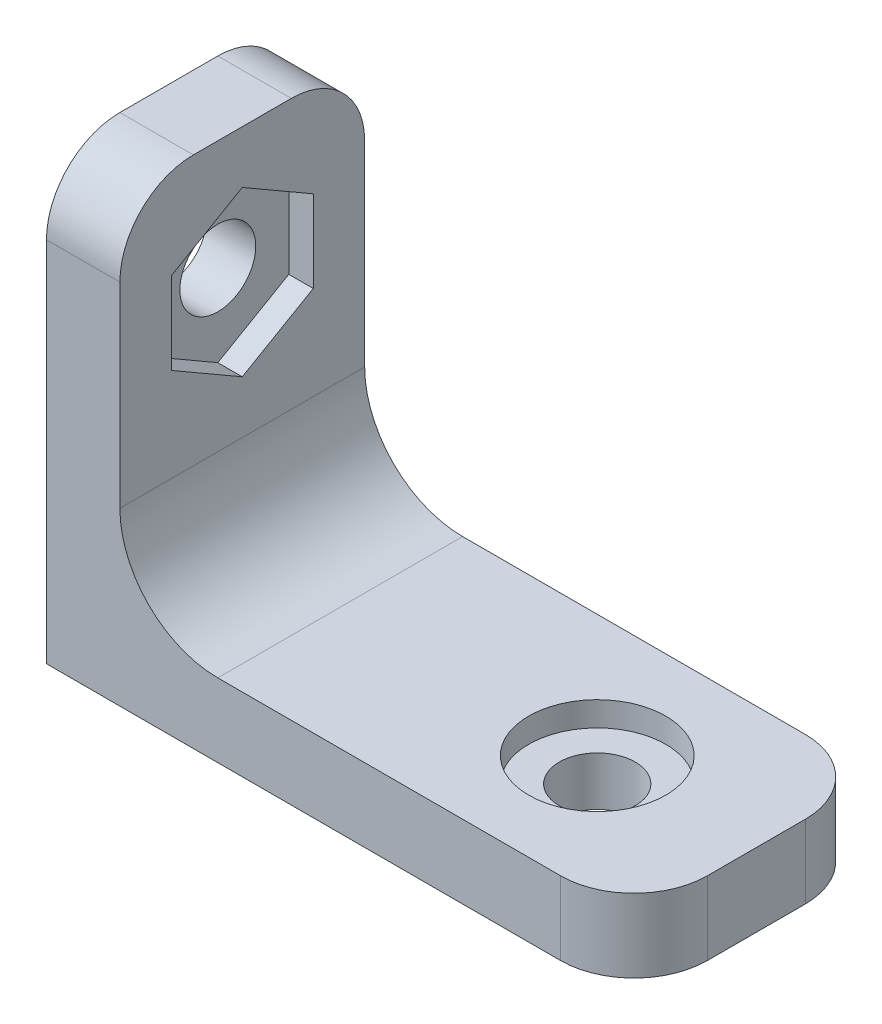
ISO-10303-21;
HEADER;
FILE_DESCRIPTION(('STEP AP214'),'2;1');
FILE_NAME('part.step','',(''),(''),'','','');
FILE_SCHEMA(('AUTOMOTIVE_DESIGN { 1 0 10303 214 1 1 1 1 }'));
ENDSEC;
DATA;
#1=APPLICATION_CONTEXT('core data for automotive mechanical design processes');
#2=APPLICATION_PROTOCOL_DEFINITION('international standard','automotive_design',2000,#1);
#3=PRODUCT_CONTEXT('',#1,'mechanical');
#4=PRODUCT('Part','Part','',(#3));
#5=PRODUCT_RELATED_PRODUCT_CATEGORY('part','',(#4));
#6=PRODUCT_DEFINITION_FORMATION('','',#4);
#7=PRODUCT_DEFINITION_CONTEXT('part definition',#1,'design');
#8=PRODUCT_DEFINITION('design','',#6,#7);
#9=PRODUCT_DEFINITION_SHAPE('','',#8);
#10=(LENGTH_UNIT() NAMED_UNIT(*) SI_UNIT(.MILLI.,.METRE.));
#11=(NAMED_UNIT(*) PLANE_ANGLE_UNIT() SI_UNIT($,.RADIAN.));
#12=(NAMED_UNIT(*) SI_UNIT($,.STERADIAN.) SOLID_ANGLE_UNIT());
#13=UNCERTAINTY_MEASURE_WITH_UNIT(LENGTH_MEASURE(1.E-05),#10,'distance_accuracy_value','');
#14=(GEOMETRIC_REPRESENTATION_CONTEXT(3) GLOBAL_UNCERTAINTY_ASSIGNED_CONTEXT((#13)) GLOBAL_UNIT_ASSIGNED_CONTEXT((#10,
#11,#12)) REPRESENTATION_CONTEXT('',''));
#15=CARTESIAN_POINT('',(0.,0.,0.));
#16=DIRECTION('',(0.,0.,1.));
#17=DIRECTION('',(1.,0.,0.));
#18=AXIS2_PLACEMENT_3D('',#15,#16,#17);
#19=CARTESIAN_POINT('',(7.3840620433566,12.5,-5.));
#20=DIRECTION('',(-1.,0.,0.));
#21=DIRECTION('',(0.,0.,1.));
#22=AXIS2_PLACEMENT_3D('',#19,#20,#21);
#23=CYLINDRICAL_SURFACE('',#22,1.55);
#24=CARTESIAN_POINT('',(0.,12.5,-5.));
#25=DIRECTION('',(-1.,0.,0.));
#26=DIRECTION('',(0.,0.,1.));
#27=AXIS2_PLACEMENT_3D('',#24,#25,#26);
#28=CIRCLE('',#27,1.55);
#29=CARTESIAN_POINT('',(0.,12.5,-3.45));
#30=VERTEX_POINT('',#29);
#31=EDGE_CURVE('E276',#30,#30,#28,.T.);
#32=ORIENTED_EDGE('',*,*,#31,.T.);
#33=EDGE_LOOP('',(#32));
#34=FACE_BOUND('',#33,.T.);
#35=CARTESIAN_POINT('',(2.,12.5,-5.));
#36=DIRECTION('',(1.,0.,0.));
#37=DIRECTION('',(0.,0.,-1.));
#38=AXIS2_PLACEMENT_3D('',#35,#36,#37);
#39=CIRCLE('',#38,1.55);
#40=CARTESIAN_POINT('',(2.,12.5,-6.55));
#41=VERTEX_POINT('',#40);
#42=EDGE_CURVE('E255',#41,#41,#39,.F.);
#43=ORIENTED_EDGE('',*,*,#42,.F.);
#44=EDGE_LOOP('',(#43));
#45=FACE_BOUND('',#44,.T.);
#46=ADVANCED_FACE('F36',(#34,#45),#23,.F.);
#47=CARTESIAN_POINT('',(17.5,3.,-5.));
#48=DIRECTION('',(0.,-1.,0.));
#49=DIRECTION('',(0.,0.,-1.));
#50=AXIS2_PLACEMENT_3D('',#47,#48,#49);
#51=CYLINDRICAL_SURFACE('',#50,1.55);
#52=CARTESIAN_POINT('',(17.5,0.,-5.));
#53=DIRECTION('',(0.,1.,0.));
#54=DIRECTION('',(0.,0.,1.));
#55=AXIS2_PLACEMENT_3D('',#52,#53,#54);
#56=CIRCLE('',#55,1.55);
#57=CARTESIAN_POINT('',(17.5,0.,-3.45));
#58=VERTEX_POINT('',#57);
#59=EDGE_CURVE('E295',#58,#58,#56,.T.);
#60=ORIENTED_EDGE('',*,*,#59,.F.);
#61=EDGE_LOOP('',(#60));
#62=FACE_BOUND('',#61,.T.);
#63=CARTESIAN_POINT('',(17.5,2.,-5.));
#64=DIRECTION('',(0.,1.,0.));
#65=DIRECTION('',(0.,0.,1.));
#66=AXIS2_PLACEMENT_3D('',#63,#64,#65);
#67=CIRCLE('',#66,1.55);
#68=CARTESIAN_POINT('',(17.5,2.,-3.45));
#69=VERTEX_POINT('',#68);
#70=EDGE_CURVE('E271',#69,#69,#67,.T.);
#71=ORIENTED_EDGE('',*,*,#70,.T.);
#72=EDGE_LOOP('',(#71));
#73=FACE_BOUND('',#72,.T.);
#74=ADVANCED_FACE('F430',(#62,#73),#51,.F.);
#75=CARTESIAN_POINT('',(0.,3.,0.));
#76=DIRECTION('',(0.,-1.,0.));
#77=DIRECTION('',(0.,0.,-1.));
#78=AXIS2_PLACEMENT_3D('',#75,#76,#77);
#79=PLANE('',#78);
#80=CARTESIAN_POINT('',(17.5,3.,-5.));
#81=DIRECTION('',(0.,1.,0.));
#82=DIRECTION('',(0.,0.,1.));
#83=AXIS2_PLACEMENT_3D('',#80,#81,#82);
#84=CIRCLE('',#83,2.8);
#85=CARTESIAN_POINT('',(17.5,3.,-2.2));
#86=VERTEX_POINT('',#85);
#87=EDGE_CURVE('E272',#86,#86,#84,.T.);
#88=ORIENTED_EDGE('',*,*,#87,.F.);
#89=EDGE_LOOP('',(#88));
#90=FACE_BOUND('',#89,.T.);
#91=DIRECTION('',(-1.,0.,0.));
#92=VECTOR('',#91,1.);
#93=CARTESIAN_POINT('',(0.,3.,-10.));
#94=LINE('',#93,#92);
#95=CARTESIAN_POINT('',(21.,3.,-10.));
#96=VERTEX_POINT('',#95);
#97=CARTESIAN_POINT('',(7.,3.,-10.));
#98=VERTEX_POINT('',#97);
#99=EDGE_CURVE('E308',#96,#98,#94,.T.);
#100=ORIENTED_EDGE('',*,*,#99,.T.);
#101=DIRECTION('',(0.,0.,-1.));
#102=VECTOR('',#101,1.);
#103=CARTESIAN_POINT('',(7.,3.,0.));
#104=LINE('',#103,#102);
#105=CARTESIAN_POINT('',(7.,3.,0.));
#106=VERTEX_POINT('',#105);
#107=EDGE_CURVE('E62',#98,#106,#104,.F.);
#108=ORIENTED_EDGE('',*,*,#107,.T.);
#109=DIRECTION('',(1.,0.,0.));
#110=VECTOR('',#109,1.);
#111=CARTESIAN_POINT('',(0.,3.,0.));
#112=LINE('',#111,#110);
#113=CARTESIAN_POINT('',(21.,3.,0.));
#114=VERTEX_POINT('',#113);
#115=EDGE_CURVE('E300',#106,#114,#112,.T.);
#116=ORIENTED_EDGE('',*,*,#115,.T.);
#117=CARTESIAN_POINT('',(21.,3.,-3.));
#118=DIRECTION('',(0.,-1.,0.));
#119=DIRECTION('',(0.,0.,-1.));
#120=AXIS2_PLACEMENT_3D('',#117,#118,#119);
#121=CIRCLE('',#120,3.);
#122=CARTESIAN_POINT('',(24.,3.,-3.));
#123=VERTEX_POINT('',#122);
#124=EDGE_CURVE('E387',#114,#123,#121,.F.);
#125=ORIENTED_EDGE('',*,*,#124,.T.);
#126=DIRECTION('',(0.,0.,-1.));
#127=VECTOR('',#126,1.);
#128=CARTESIAN_POINT('',(24.,3.,0.));
#129=LINE('',#128,#127);
#130=CARTESIAN_POINT('',(24.,3.,-7.));
#131=VERTEX_POINT('',#130);
#132=EDGE_CURVE('E303',#123,#131,#129,.T.);
#133=ORIENTED_EDGE('',*,*,#132,.T.);
#134=CARTESIAN_POINT('',(21.,3.,-7.));
#135=DIRECTION('',(0.,-1.,0.));
#136=DIRECTION('',(0.,0.,-1.));
#137=AXIS2_PLACEMENT_3D('',#134,#135,#136);
#138=CIRCLE('',#137,3.);
#139=EDGE_CURVE('E384',#131,#96,#138,.F.);
#140=ORIENTED_EDGE('',*,*,#139,.T.);
#141=EDGE_LOOP('',(#100,#108,#116,#125,#133,#140));
#142=FACE_BOUND('',#141,.T.);
#143=ADVANCED_FACE('F436',(#90,#142),#79,.F.);
#144=CARTESIAN_POINT('',(0.,0.,0.));
#145=DIRECTION('',(0.,-1.,0.));
#146=DIRECTION('',(0.,0.,-1.));
#147=AXIS2_PLACEMENT_3D('',#144,#145,#146);
#148=PLANE('',#147);
#149=DIRECTION('',(0.,0.,-1.));
#150=VECTOR('',#149,1.);
#151=CARTESIAN_POINT('',(24.,0.,0.));
#152=LINE('',#151,#150);
#153=CARTESIAN_POINT('',(24.,0.,-3.));
#154=VERTEX_POINT('',#153);
#155=CARTESIAN_POINT('',(24.,0.,-7.));
#156=VERTEX_POINT('',#155);
#157=EDGE_CURVE('E319',#154,#156,#152,.T.);
#158=ORIENTED_EDGE('',*,*,#157,.F.);
#159=CARTESIAN_POINT('',(21.,0.,-3.));
#160=DIRECTION('',(0.,-1.,0.));
#161=DIRECTION('',(0.,0.,-1.));
#162=AXIS2_PLACEMENT_3D('',#159,#160,#161);
#163=CIRCLE('',#162,3.);
#164=CARTESIAN_POINT('',(21.,0.,0.));
#165=VERTEX_POINT('',#164);
#166=EDGE_CURVE('E381',#154,#165,#163,.T.);
#167=ORIENTED_EDGE('',*,*,#166,.T.);
#168=DIRECTION('',(1.,0.,0.));
#169=VECTOR('',#168,1.);
#170=CARTESIAN_POINT('',(0.,0.,0.));
#171=LINE('',#170,#169);
#172=CARTESIAN_POINT('',(0.,0.,0.));
#173=VERTEX_POINT('',#172);
#174=EDGE_CURVE('E315',#173,#165,#171,.T.);
#175=ORIENTED_EDGE('',*,*,#174,.F.);
#176=DIRECTION('',(0.,0.,1.));
#177=VECTOR('',#176,1.);
#178=CARTESIAN_POINT('',(0.,0.,0.));
#179=LINE('',#178,#177);
#180=CARTESIAN_POINT('',(0.,0.,-10.));
#181=VERTEX_POINT('',#180);
#182=EDGE_CURVE('E299',#181,#173,#179,.T.);
#183=ORIENTED_EDGE('',*,*,#182,.F.);
#184=DIRECTION('',(-1.,0.,0.));
#185=VECTOR('',#184,1.);
#186=CARTESIAN_POINT('',(0.,0.,-10.));
#187=LINE('',#186,#185);
#188=CARTESIAN_POINT('',(21.,0.,-10.));
#189=VERTEX_POINT('',#188);
#190=EDGE_CURVE('E304',#189,#181,#187,.T.);
#191=ORIENTED_EDGE('',*,*,#190,.F.);
#192=CARTESIAN_POINT('',(21.,0.,-7.));
#193=DIRECTION('',(0.,-1.,0.));
#194=DIRECTION('',(0.,0.,-1.));
#195=AXIS2_PLACEMENT_3D('',#192,#193,#194);
#196=CIRCLE('',#195,3.);
#197=EDGE_CURVE('E378',#189,#156,#196,.T.);
#198=ORIENTED_EDGE('',*,*,#197,.T.);
#199=EDGE_LOOP('',(#158,#167,#175,#183,#191,#198));
#200=FACE_BOUND('',#199,.T.);
#201=ORIENTED_EDGE('',*,*,#59,.T.);
#202=EDGE_LOOP('',(#201));
#203=FACE_BOUND('',#202,.T.);
#204=ADVANCED_FACE('F451',(#200,#203),#148,.T.);
#205=CARTESIAN_POINT('',(0.,3.,0.));
#206=DIRECTION('',(1.,0.,0.));
#207=DIRECTION('',(0.,0.,-1.));
#208=AXIS2_PLACEMENT_3D('',#205,#206,#207);
#209=PLANE('',#208);
#210=ORIENTED_EDGE('',*,*,#31,.F.);
#211=EDGE_LOOP('',(#210));
#212=FACE_BOUND('',#211,.T.);
#213=DIRECTION('',(0.,0.,1.));
#214=VECTOR('',#213,1.);
#215=CARTESIAN_POINT('',(0.,18.,-10.));
#216=LINE('',#215,#214);
#217=CARTESIAN_POINT('',(0.,18.,-7.));
#218=VERTEX_POINT('',#217);
#219=CARTESIAN_POINT('',(0.,18.,-3.));
#220=VERTEX_POINT('',#219);
#221=EDGE_CURVE('E280',#218,#220,#216,.T.);
#222=ORIENTED_EDGE('',*,*,#221,.F.);
#223=CARTESIAN_POINT('',(0.,15.,-7.));
#224=DIRECTION('',(1.,0.,0.));
#225=DIRECTION('',(0.,0.,-1.));
#226=AXIS2_PLACEMENT_3D('',#223,#224,#225);
#227=CIRCLE('',#226,3.);
#228=CARTESIAN_POINT('',(0.,15.,-10.));
#229=VERTEX_POINT('',#228);
#230=EDGE_CURVE('E348',#218,#229,#227,.F.);
#231=ORIENTED_EDGE('',*,*,#230,.T.);
#232=DIRECTION('',(0.,-1.,0.));
#233=VECTOR('',#232,1.);
#234=CARTESIAN_POINT('',(0.,3.,-10.));
#235=LINE('',#234,#233);
#236=EDGE_CURVE('E311',#229,#181,#235,.T.);
#237=ORIENTED_EDGE('',*,*,#236,.T.);
#238=ORIENTED_EDGE('',*,*,#182,.T.);
#239=DIRECTION('',(0.,-1.,0.));
#240=VECTOR('',#239,1.);
#241=CARTESIAN_POINT('',(0.,3.,0.));
#242=LINE('',#241,#240);
#243=CARTESIAN_POINT('',(0.,15.,0.));
#244=VERTEX_POINT('',#243);
#245=EDGE_CURVE('E328',#244,#173,#242,.T.);
#246=ORIENTED_EDGE('',*,*,#245,.F.);
#247=CARTESIAN_POINT('',(0.,15.,-3.));
#248=DIRECTION('',(1.,0.,0.));
#249=DIRECTION('',(0.,0.,-1.));
#250=AXIS2_PLACEMENT_3D('',#247,#248,#249);
#251=CIRCLE('',#250,3.);
#252=EDGE_CURVE('E345',#244,#220,#251,.F.);
#253=ORIENTED_EDGE('',*,*,#252,.T.);
#254=EDGE_LOOP('',(#222,#231,#237,#238,#246,#253));
#255=FACE_BOUND('',#254,.T.);
#256=ADVANCED_FACE('F455',(#212,#255),#209,.F.);
#257=CARTESIAN_POINT('',(0.,3.,0.));
#258=DIRECTION('',(0.,0.,-1.));
#259=DIRECTION('',(-1.,0.,0.));
#260=AXIS2_PLACEMENT_3D('',#257,#258,#259);
#261=PLANE('',#260);
#262=DIRECTION('',(0.,-1.,0.));
#263=VECTOR('',#262,1.);
#264=CARTESIAN_POINT('',(3.,18.,0.));
#265=LINE('',#264,#263);
#266=CARTESIAN_POINT('',(3.,15.,0.));
#267=VERTEX_POINT('',#266);
#268=CARTESIAN_POINT('',(3.,7.,0.));
#269=VERTEX_POINT('',#268);
#270=EDGE_CURVE('E291',#267,#269,#265,.T.);
#271=ORIENTED_EDGE('',*,*,#270,.F.);
#272=DIRECTION('',(1.,0.,0.));
#273=VECTOR('',#272,1.);
#274=CARTESIAN_POINT('',(0.,15.,0.));
#275=LINE('',#274,#273);
#276=EDGE_CURVE('E368',#267,#244,#275,.F.);
#277=ORIENTED_EDGE('',*,*,#276,.T.);
#278=ORIENTED_EDGE('',*,*,#245,.T.);
#279=ORIENTED_EDGE('',*,*,#174,.T.);
#280=DIRECTION('',(0.,-1.,0.));
#281=VECTOR('',#280,1.);
#282=CARTESIAN_POINT('',(21.,3.,0.));
#283=LINE('',#282,#281);
#284=EDGE_CURVE('E364',#165,#114,#283,.F.);
#285=ORIENTED_EDGE('',*,*,#284,.T.);
#286=ORIENTED_EDGE('',*,*,#115,.F.);
#287=CARTESIAN_POINT('',(7.,7.,0.));
#288=DIRECTION('',(0.,0.,-1.));
#289=DIRECTION('',(-1.,0.,0.));
#290=AXIS2_PLACEMENT_3D('',#287,#288,#289);
#291=CIRCLE('',#290,4.);
#292=EDGE_CURVE('E11',#106,#269,#291,.T.);
#293=ORIENTED_EDGE('',*,*,#292,.T.);
#294=EDGE_LOOP('',(#271,#277,#278,#279,#285,#286,#293));
#295=FACE_BOUND('',#294,.T.);
#296=ADVANCED_FACE('F420',(#295),#261,.F.);
#297=CARTESIAN_POINT('',(24.,3.,0.));
#298=DIRECTION('',(-1.,0.,0.));
#299=DIRECTION('',(0.,0.,1.));
#300=AXIS2_PLACEMENT_3D('',#297,#298,#299);
#301=PLANE('',#300);
#302=ORIENTED_EDGE('',*,*,#132,.F.);
#303=DIRECTION('',(0.,-1.,0.));
#304=VECTOR('',#303,1.);
#305=CARTESIAN_POINT('',(24.,3.,-3.));
#306=LINE('',#305,#304);
#307=EDGE_CURVE('E374',#123,#154,#306,.T.);
#308=ORIENTED_EDGE('',*,*,#307,.T.);
#309=ORIENTED_EDGE('',*,*,#157,.T.);
#310=DIRECTION('',(0.,-1.,0.));
#311=VECTOR('',#310,1.);
#312=CARTESIAN_POINT('',(24.,3.,-7.));
#313=LINE('',#312,#311);
#314=EDGE_CURVE('E371',#156,#131,#313,.F.);
#315=ORIENTED_EDGE('',*,*,#314,.T.);
#316=EDGE_LOOP('',(#302,#308,#309,#315));
#317=FACE_BOUND('',#316,.T.);
#318=ADVANCED_FACE('F459',(#317),#301,.F.);
#319=CARTESIAN_POINT('',(0.,3.,-10.));
#320=DIRECTION('',(0.,0.,1.));
#321=DIRECTION('',(1.,0.,0.));
#322=AXIS2_PLACEMENT_3D('',#319,#320,#321);
#323=PLANE('',#322);
#324=ORIENTED_EDGE('',*,*,#236,.F.);
#325=DIRECTION('',(-1.,0.,0.));
#326=VECTOR('',#325,1.);
#327=CARTESIAN_POINT('',(3.,15.,-10.));
#328=LINE('',#327,#326);
#329=CARTESIAN_POINT('',(3.,15.,-10.));
#330=VERTEX_POINT('',#329);
#331=EDGE_CURVE('E355',#229,#330,#328,.F.);
#332=ORIENTED_EDGE('',*,*,#331,.T.);
#333=DIRECTION('',(0.,-1.,0.));
#334=VECTOR('',#333,1.);
#335=CARTESIAN_POINT('',(3.,18.,-10.));
#336=LINE('',#335,#334);
#337=CARTESIAN_POINT('',(3.,7.,-10.));
#338=VERTEX_POINT('',#337);
#339=EDGE_CURVE('E288',#330,#338,#336,.T.);
#340=ORIENTED_EDGE('',*,*,#339,.T.);
#341=CARTESIAN_POINT('',(7.,7.,-10.));
#342=DIRECTION('',(0.,0.,1.));
#343=DIRECTION('',(1.,0.,0.));
#344=AXIS2_PLACEMENT_3D('',#341,#342,#343);
#345=CIRCLE('',#344,4.);
#346=EDGE_CURVE('E45',#338,#98,#345,.T.);
#347=ORIENTED_EDGE('',*,*,#346,.T.);
#348=ORIENTED_EDGE('',*,*,#99,.F.);
#349=DIRECTION('',(0.,-1.,0.));
#350=VECTOR('',#349,1.);
#351=CARTESIAN_POINT('',(21.,3.,-10.));
#352=LINE('',#351,#350);
#353=EDGE_CURVE('E351',#96,#189,#352,.T.);
#354=ORIENTED_EDGE('',*,*,#353,.T.);
#355=ORIENTED_EDGE('',*,*,#190,.T.);
#356=EDGE_LOOP('',(#324,#332,#340,#347,#348,#354,#355));
#357=FACE_BOUND('',#356,.T.);
#358=ADVANCED_FACE('F405',(#357),#323,.F.);
#359=CARTESIAN_POINT('',(3.,18.,-10.));
#360=DIRECTION('',(-1.,0.,0.));
#361=DIRECTION('',(0.,0.,1.));
#362=AXIS2_PLACEMENT_3D('',#359,#360,#361);
#363=PLANE('',#362);
#364=DIRECTION('',(0.,0.5,0.866025403784439));
#365=VECTOR('',#364,1.);
#366=CARTESIAN_POINT('',(3.,14.1743157806499,-7.9));
#367=LINE('',#366,#365);
#368=CARTESIAN_POINT('',(3.,14.1743157806499,-7.9));
#369=VERTEX_POINT('',#368);
#370=CARTESIAN_POINT('',(3.,15.8486315612998,-5.));
#371=VERTEX_POINT('',#370);
#372=EDGE_CURVE('E238',#369,#371,#367,.T.);
#373=ORIENTED_EDGE('',*,*,#372,.F.);
#374=DIRECTION('',(0.,1.,0.));
#375=VECTOR('',#374,1.);
#376=CARTESIAN_POINT('',(3.,10.8256842193501,-7.9));
#377=LINE('',#376,#375);
#378=CARTESIAN_POINT('',(3.,10.8256842193501,-7.9));
#379=VERTEX_POINT('',#378);
#380=EDGE_CURVE('E196',#379,#369,#377,.T.);
#381=ORIENTED_EDGE('',*,*,#380,.F.);
#382=DIRECTION('',(0.,0.5,-0.866025403784439));
#383=VECTOR('',#382,1.);
#384=CARTESIAN_POINT('',(3.,9.15136843870017,-5.));
#385=LINE('',#384,#383);
#386=CARTESIAN_POINT('',(3.,9.15136843870017,-5.));
#387=VERTEX_POINT('',#386);
#388=EDGE_CURVE('E218',#387,#379,#385,.T.);
#389=ORIENTED_EDGE('',*,*,#388,.F.);
#390=DIRECTION('',(0.,-0.5,-0.866025403784439));
#391=VECTOR('',#390,1.);
#392=CARTESIAN_POINT('',(3.,10.8256842193501,-2.1));
#393=LINE('',#392,#391);
#394=CARTESIAN_POINT('',(3.,10.8256842193501,-2.1));
#395=VERTEX_POINT('',#394);
#396=EDGE_CURVE('E222',#395,#387,#393,.T.);
#397=ORIENTED_EDGE('',*,*,#396,.F.);
#398=DIRECTION('',(0.,-1.,0.));
#399=VECTOR('',#398,1.);
#400=CARTESIAN_POINT('',(3.,14.1743157806499,-2.1));
#401=LINE('',#400,#399);
#402=CARTESIAN_POINT('',(3.,14.1743157806499,-2.1));
#403=VERTEX_POINT('',#402);
#404=EDGE_CURVE('E245',#403,#395,#401,.T.);
#405=ORIENTED_EDGE('',*,*,#404,.F.);
#406=DIRECTION('',(0.,-0.5,0.866025403784439));
#407=VECTOR('',#406,1.);
#408=CARTESIAN_POINT('',(3.,15.8486315612998,-5.));
#409=LINE('',#408,#407);
#410=EDGE_CURVE('E241',#371,#403,#409,.T.);
#411=ORIENTED_EDGE('',*,*,#410,.F.);
#412=EDGE_LOOP('',(#373,#381,#389,#397,#405,#411));
#413=FACE_BOUND('',#412,.T.);
#414=ORIENTED_EDGE('',*,*,#270,.T.);
#415=DIRECTION('',(0.,0.,-1.));
#416=VECTOR('',#415,1.);
#417=CARTESIAN_POINT('',(3.,7.,-10.));
#418=LINE('',#417,#416);
#419=EDGE_CURVE('E390',#269,#338,#418,.T.);
#420=ORIENTED_EDGE('',*,*,#419,.T.);
#421=ORIENTED_EDGE('',*,*,#339,.F.);
#422=CARTESIAN_POINT('',(3.,15.,-7.));
#423=DIRECTION('',(-1.,0.,0.));
#424=DIRECTION('',(0.,0.,1.));
#425=AXIS2_PLACEMENT_3D('',#422,#423,#424);
#426=CIRCLE('',#425,3.);
#427=CARTESIAN_POINT('',(3.,18.,-7.));
#428=VERTEX_POINT('',#427);
#429=EDGE_CURVE('E361',#330,#428,#426,.F.);
#430=ORIENTED_EDGE('',*,*,#429,.T.);
#431=DIRECTION('',(0.,0.,-1.));
#432=VECTOR('',#431,1.);
#433=CARTESIAN_POINT('',(3.,18.,-10.));
#434=LINE('',#433,#432);
#435=CARTESIAN_POINT('',(3.,18.,-3.));
#436=VERTEX_POINT('',#435);
#437=EDGE_CURVE('E284',#436,#428,#434,.T.);
#438=ORIENTED_EDGE('',*,*,#437,.F.);
#439=CARTESIAN_POINT('',(3.,15.,-3.));
#440=DIRECTION('',(-1.,0.,0.));
#441=DIRECTION('',(0.,0.,1.));
#442=AXIS2_PLACEMENT_3D('',#439,#440,#441);
#443=CIRCLE('',#442,3.);
#444=EDGE_CURVE('E358',#436,#267,#443,.F.);
#445=ORIENTED_EDGE('',*,*,#444,.T.);
#446=EDGE_LOOP('',(#414,#420,#421,#430,#438,#445));
#447=FACE_BOUND('',#446,.T.);
#448=ADVANCED_FACE('F399',(#413,#447),#363,.F.);
#449=CARTESIAN_POINT('',(0.,18.,0.));
#450=DIRECTION('',(0.,1.,0.));
#451=DIRECTION('',(0.,0.,1.));
#452=AXIS2_PLACEMENT_3D('',#449,#450,#451);
#453=PLANE('',#452);
#454=ORIENTED_EDGE('',*,*,#437,.T.);
#455=DIRECTION('',(-1.,0.,0.));
#456=VECTOR('',#455,1.);
#457=CARTESIAN_POINT('',(0.,18.,-7.));
#458=LINE('',#457,#456);
#459=EDGE_CURVE('E341',#428,#218,#458,.T.);
#460=ORIENTED_EDGE('',*,*,#459,.T.);
#461=ORIENTED_EDGE('',*,*,#221,.T.);
#462=DIRECTION('',(1.,0.,0.));
#463=VECTOR('',#462,1.);
#464=CARTESIAN_POINT('',(3.,18.,-3.));
#465=LINE('',#464,#463);
#466=EDGE_CURVE('E331',#220,#436,#465,.T.);
#467=ORIENTED_EDGE('',*,*,#466,.T.);
#468=EDGE_LOOP('',(#454,#460,#461,#467));
#469=FACE_BOUND('',#468,.T.);
#470=ADVANCED_FACE('F412',(#469),#453,.T.);
#471=CARTESIAN_POINT('',(17.5,2.,-5.));
#472=DIRECTION('',(0.,1.,0.));
#473=DIRECTION('',(0.,0.,1.));
#474=AXIS2_PLACEMENT_3D('',#471,#472,#473);
#475=CYLINDRICAL_SURFACE('',#474,2.8);
#476=CARTESIAN_POINT('',(17.5,2.,-5.));
#477=DIRECTION('',(0.,1.,0.));
#478=DIRECTION('',(0.,0.,1.));
#479=AXIS2_PLACEMENT_3D('',#476,#477,#478);
#480=CIRCLE('',#479,2.8);
#481=CARTESIAN_POINT('',(17.5,2.,-2.2));
#482=VERTEX_POINT('',#481);
#483=EDGE_CURVE('E267',#482,#482,#480,.T.);
#484=ORIENTED_EDGE('',*,*,#483,.F.);
#485=EDGE_LOOP('',(#484));
#486=FACE_BOUND('',#485,.T.);
#487=ORIENTED_EDGE('',*,*,#87,.T.);
#488=EDGE_LOOP('',(#487));
#489=FACE_BOUND('',#488,.T.);
#490=ADVANCED_FACE('F442',(#486,#489),#475,.F.);
#491=CARTESIAN_POINT('',(17.5,2.,-5.));
#492=DIRECTION('',(0.,1.,0.));
#493=DIRECTION('',(0.,0.,1.));
#494=AXIS2_PLACEMENT_3D('',#491,#492,#493);
#495=PLANE('',#494);
#496=ORIENTED_EDGE('',*,*,#70,.F.);
#497=EDGE_LOOP('',(#496));
#498=FACE_BOUND('',#497,.T.);
#499=ORIENTED_EDGE('',*,*,#483,.T.);
#500=EDGE_LOOP('',(#499));
#501=FACE_BOUND('',#500,.T.);
#502=ADVANCED_FACE('F493',(#498,#501),#495,.T.);
#503=CARTESIAN_POINT('',(2.,0.,0.));
#504=DIRECTION('',(1.,0.,0.));
#505=DIRECTION('',(0.,0.,-1.));
#506=AXIS2_PLACEMENT_3D('',#503,#504,#505);
#507=PLANE('',#506);
#508=DIRECTION('',(0.,1.,0.));
#509=VECTOR('',#508,1.);
#510=CARTESIAN_POINT('',(2.,10.8256842193501,-7.9));
#511=LINE('',#510,#509);
#512=CARTESIAN_POINT('',(2.,10.8256842193501,-7.9));
#513=VERTEX_POINT('',#512);
#514=CARTESIAN_POINT('',(2.,14.1743157806499,-7.9));
#515=VERTEX_POINT('',#514);
#516=EDGE_CURVE('E193',#513,#515,#511,.T.);
#517=ORIENTED_EDGE('',*,*,#516,.T.);
#518=DIRECTION('',(0.,0.5,0.866025403784439));
#519=VECTOR('',#518,1.);
#520=CARTESIAN_POINT('',(2.,14.1743157806499,-7.9));
#521=LINE('',#520,#519);
#522=CARTESIAN_POINT('',(2.,15.8486315612998,-5.));
#523=VERTEX_POINT('',#522);
#524=EDGE_CURVE('E205',#515,#523,#521,.T.);
#525=ORIENTED_EDGE('',*,*,#524,.T.);
#526=DIRECTION('',(0.,-0.5,0.866025403784439));
#527=VECTOR('',#526,1.);
#528=CARTESIAN_POINT('',(2.,15.8486315612998,-5.));
#529=LINE('',#528,#527);
#530=CARTESIAN_POINT('',(2.,14.1743157806499,-2.1));
#531=VERTEX_POINT('',#530);
#532=EDGE_CURVE('E211',#523,#531,#529,.T.);
#533=ORIENTED_EDGE('',*,*,#532,.T.);
#534=DIRECTION('',(0.,-1.,0.));
#535=VECTOR('',#534,1.);
#536=CARTESIAN_POINT('',(2.,14.1743157806499,-2.1));
#537=LINE('',#536,#535);
#538=CARTESIAN_POINT('',(2.,10.8256842193501,-2.1));
#539=VERTEX_POINT('',#538);
#540=EDGE_CURVE('E227',#531,#539,#537,.T.);
#541=ORIENTED_EDGE('',*,*,#540,.T.);
#542=DIRECTION('',(0.,-0.5,-0.866025403784439));
#543=VECTOR('',#542,1.);
#544=CARTESIAN_POINT('',(2.,10.8256842193501,-2.1));
#545=LINE('',#544,#543);
#546=CARTESIAN_POINT('',(2.,9.15136843870017,-5.));
#547=VERTEX_POINT('',#546);
#548=EDGE_CURVE('E231',#539,#547,#545,.T.);
#549=ORIENTED_EDGE('',*,*,#548,.T.);
#550=DIRECTION('',(0.,0.5,-0.866025403784439));
#551=VECTOR('',#550,1.);
#552=CARTESIAN_POINT('',(2.,9.15136843870017,-5.));
#553=LINE('',#552,#551);
#554=EDGE_CURVE('E202',#547,#513,#553,.T.);
#555=ORIENTED_EDGE('',*,*,#554,.T.);
#556=EDGE_LOOP('',(#517,#525,#533,#541,#549,#555));
#557=FACE_BOUND('',#556,.T.);
#558=ORIENTED_EDGE('',*,*,#42,.T.);
#559=EDGE_LOOP('',(#558));
#560=FACE_BOUND('',#559,.T.);
#561=ADVANCED_FACE('F213',(#557,#560),#507,.T.);
#562=CARTESIAN_POINT('',(2.,10.8256842193501,-7.9));
#563=DIRECTION('',(0.,0.,-1.));
#564=DIRECTION('',(-1.,0.,0.));
#565=AXIS2_PLACEMENT_3D('',#562,#563,#564);
#566=PLANE('',#565);
#567=ORIENTED_EDGE('',*,*,#380,.T.);
#568=DIRECTION('',(1.,0.,0.));
#569=VECTOR('',#568,1.);
#570=CARTESIAN_POINT('',(2.,14.1743157806499,-7.9));
#571=LINE('',#570,#569);
#572=EDGE_CURVE('E189',#515,#369,#571,.T.);
#573=ORIENTED_EDGE('',*,*,#572,.F.);
#574=ORIENTED_EDGE('',*,*,#516,.F.);
#575=DIRECTION('',(1.,0.,0.));
#576=VECTOR('',#575,1.);
#577=CARTESIAN_POINT('',(2.,10.8256842193501,-7.9));
#578=LINE('',#577,#576);
#579=EDGE_CURVE('E252',#513,#379,#578,.T.);
#580=ORIENTED_EDGE('',*,*,#579,.T.);
#581=EDGE_LOOP('',(#567,#573,#574,#580));
#582=FACE_BOUND('',#581,.T.);
#583=ADVANCED_FACE('F191',(#582),#566,.F.);
#584=CARTESIAN_POINT('',(2.,9.15136843870017,-5.));
#585=DIRECTION('',(0.,-0.866025403784439,-0.5));
#586=DIRECTION('',(0.,0.5,-0.866025403784439));
#587=AXIS2_PLACEMENT_3D('',#584,#585,#586);
#588=PLANE('',#587);
#589=ORIENTED_EDGE('',*,*,#388,.T.);
#590=ORIENTED_EDGE('',*,*,#579,.F.);
#591=ORIENTED_EDGE('',*,*,#554,.F.);
#592=DIRECTION('',(1.,0.,0.));
#593=VECTOR('',#592,1.);
#594=CARTESIAN_POINT('',(2.,9.15136843870017,-5.));
#595=LINE('',#594,#593);
#596=EDGE_CURVE('E256',#547,#387,#595,.T.);
#597=ORIENTED_EDGE('',*,*,#596,.T.);
#598=EDGE_LOOP('',(#589,#590,#591,#597));
#599=FACE_BOUND('',#598,.T.);
#600=ADVANCED_FACE('F522',(#599),#588,.F.);
#601=CARTESIAN_POINT('',(2.,10.8256842193501,-2.1));
#602=DIRECTION('',(0.,-0.866025403784439,0.5));
#603=DIRECTION('',(0.,-0.5,-0.866025403784439));
#604=AXIS2_PLACEMENT_3D('',#601,#602,#603);
#605=PLANE('',#604);
#606=ORIENTED_EDGE('',*,*,#396,.T.);
#607=ORIENTED_EDGE('',*,*,#596,.F.);
#608=ORIENTED_EDGE('',*,*,#548,.F.);
#609=DIRECTION('',(1.,0.,0.));
#610=VECTOR('',#609,1.);
#611=CARTESIAN_POINT('',(2.,10.8256842193501,-2.1));
#612=LINE('',#611,#610);
#613=EDGE_CURVE('E259',#539,#395,#612,.T.);
#614=ORIENTED_EDGE('',*,*,#613,.T.);
#615=EDGE_LOOP('',(#606,#607,#608,#614));
#616=FACE_BOUND('',#615,.T.);
#617=ADVANCED_FACE('F529',(#616),#605,.F.);
#618=CARTESIAN_POINT('',(2.,14.1743157806499,-2.1));
#619=DIRECTION('',(0.,0.,1.));
#620=DIRECTION('',(1.,0.,0.));
#621=AXIS2_PLACEMENT_3D('',#618,#619,#620);
#622=PLANE('',#621);
#623=ORIENTED_EDGE('',*,*,#404,.T.);
#624=ORIENTED_EDGE('',*,*,#613,.F.);
#625=ORIENTED_EDGE('',*,*,#540,.F.);
#626=DIRECTION('',(1.,0.,0.));
#627=VECTOR('',#626,1.);
#628=CARTESIAN_POINT('',(2.,14.1743157806499,-2.1));
#629=LINE('',#628,#627);
#630=EDGE_CURVE('E262',#531,#403,#629,.T.);
#631=ORIENTED_EDGE('',*,*,#630,.T.);
#632=EDGE_LOOP('',(#623,#624,#625,#631));
#633=FACE_BOUND('',#632,.T.);
#634=ADVANCED_FACE('F537',(#633),#622,.F.);
#635=CARTESIAN_POINT('',(2.,15.8486315612998,-5.));
#636=DIRECTION('',(0.,0.866025403784439,0.5));
#637=DIRECTION('',(0.,-0.5,0.866025403784439));
#638=AXIS2_PLACEMENT_3D('',#635,#636,#637);
#639=PLANE('',#638);
#640=ORIENTED_EDGE('',*,*,#410,.T.);
#641=ORIENTED_EDGE('',*,*,#630,.F.);
#642=ORIENTED_EDGE('',*,*,#532,.F.);
#643=DIRECTION('',(1.,0.,0.));
#644=VECTOR('',#643,1.);
#645=CARTESIAN_POINT('',(2.,15.8486315612998,-5.));
#646=LINE('',#645,#644);
#647=EDGE_CURVE('E201',#523,#371,#646,.T.);
#648=ORIENTED_EDGE('',*,*,#647,.T.);
#649=EDGE_LOOP('',(#640,#641,#642,#648));
#650=FACE_BOUND('',#649,.T.);
#651=ADVANCED_FACE('F545',(#650),#639,.F.);
#652=CARTESIAN_POINT('',(2.,14.1743157806499,-7.9));
#653=DIRECTION('',(0.,0.866025403784439,-0.5));
#654=DIRECTION('',(0.,0.5,0.866025403784439));
#655=AXIS2_PLACEMENT_3D('',#652,#653,#654);
#656=PLANE('',#655);
#657=ORIENTED_EDGE('',*,*,#372,.T.);
#658=ORIENTED_EDGE('',*,*,#647,.F.);
#659=ORIENTED_EDGE('',*,*,#524,.F.);
#660=ORIENTED_EDGE('',*,*,#572,.T.);
#661=EDGE_LOOP('',(#657,#658,#659,#660));
#662=FACE_BOUND('',#661,.T.);
#663=ADVANCED_FACE('F206',(#662),#656,.F.);
#664=CARTESIAN_POINT('',(0.,15.,-7.));
#665=DIRECTION('',(1.,0.,0.));
#666=DIRECTION('',(0.,0.,-1.));
#667=AXIS2_PLACEMENT_3D('',#664,#665,#666);
#668=CYLINDRICAL_SURFACE('',#667,3.);
#669=ORIENTED_EDGE('',*,*,#429,.F.);
#670=ORIENTED_EDGE('',*,*,#331,.F.);
#671=ORIENTED_EDGE('',*,*,#230,.F.);
#672=ORIENTED_EDGE('',*,*,#459,.F.);
#673=EDGE_LOOP('',(#669,#670,#671,#672));
#674=FACE_BOUND('',#673,.T.);
#675=ADVANCED_FACE('F408',(#674),#668,.T.);
#676=CARTESIAN_POINT('',(0.,15.,-3.));
#677=DIRECTION('',(-1.,0.,0.));
#678=DIRECTION('',(0.,0.,1.));
#679=AXIS2_PLACEMENT_3D('',#676,#677,#678);
#680=CYLINDRICAL_SURFACE('',#679,3.);
#681=ORIENTED_EDGE('',*,*,#252,.F.);
#682=ORIENTED_EDGE('',*,*,#276,.F.);
#683=ORIENTED_EDGE('',*,*,#444,.F.);
#684=ORIENTED_EDGE('',*,*,#466,.F.);
#685=EDGE_LOOP('',(#681,#682,#683,#684));
#686=FACE_BOUND('',#685,.T.);
#687=ADVANCED_FACE('F417',(#686),#680,.T.);
#688=CARTESIAN_POINT('',(21.,3.,-3.));
#689=DIRECTION('',(0.,-1.,0.));
#690=DIRECTION('',(0.,0.,-1.));
#691=AXIS2_PLACEMENT_3D('',#688,#689,#690);
#692=CYLINDRICAL_SURFACE('',#691,3.);
#693=ORIENTED_EDGE('',*,*,#124,.F.);
#694=ORIENTED_EDGE('',*,*,#284,.F.);
#695=ORIENTED_EDGE('',*,*,#166,.F.);
#696=ORIENTED_EDGE('',*,*,#307,.F.);
#697=EDGE_LOOP('',(#693,#694,#695,#696));
#698=FACE_BOUND('',#697,.T.);
#699=ADVANCED_FACE('F427',(#698),#692,.T.);
#700=CARTESIAN_POINT('',(21.,3.,-7.));
#701=DIRECTION('',(0.,-1.,0.));
#702=DIRECTION('',(0.,0.,-1.));
#703=AXIS2_PLACEMENT_3D('',#700,#701,#702);
#704=CYLINDRICAL_SURFACE('',#703,3.);
#705=ORIENTED_EDGE('',*,*,#139,.F.);
#706=ORIENTED_EDGE('',*,*,#314,.F.);
#707=ORIENTED_EDGE('',*,*,#197,.F.);
#708=ORIENTED_EDGE('',*,*,#353,.F.);
#709=EDGE_LOOP('',(#705,#706,#707,#708));
#710=FACE_BOUND('',#709,.T.);
#711=ADVANCED_FACE('F423',(#710),#704,.T.);
#712=CARTESIAN_POINT('',(7.,7.,-10.));
#713=DIRECTION('',(0.,0.,1.));
#714=DIRECTION('',(1.,0.,0.));
#715=AXIS2_PLACEMENT_3D('',#712,#713,#714);
#716=CYLINDRICAL_SURFACE('',#715,4.);
#717=ORIENTED_EDGE('',*,*,#292,.F.);
#718=ORIENTED_EDGE('',*,*,#107,.F.);
#719=ORIENTED_EDGE('',*,*,#346,.F.);
#720=ORIENTED_EDGE('',*,*,#419,.F.);
#721=EDGE_LOOP('',(#717,#718,#719,#720));
#722=FACE_BOUND('',#721,.T.);
#723=ADVANCED_FACE('F38',(#722),#716,.F.);
#724=CLOSED_SHELL('',(#46,#74,#143,#204,#256,#296,#318,#358,#448,#470,#490,#502,#561,#583,#600,
#617,#634,#651,#663,#675,#687,#699,#711,#723));
#725=MANIFOLD_SOLID_BREP('B2',#724);
#726=ADVANCED_BREP_SHAPE_REPRESENTATION('',(#18,#725),#14);
#727=SHAPE_DEFINITION_REPRESENTATION(#9,#726);
ENDSEC;
END-ISO-10303-21;
